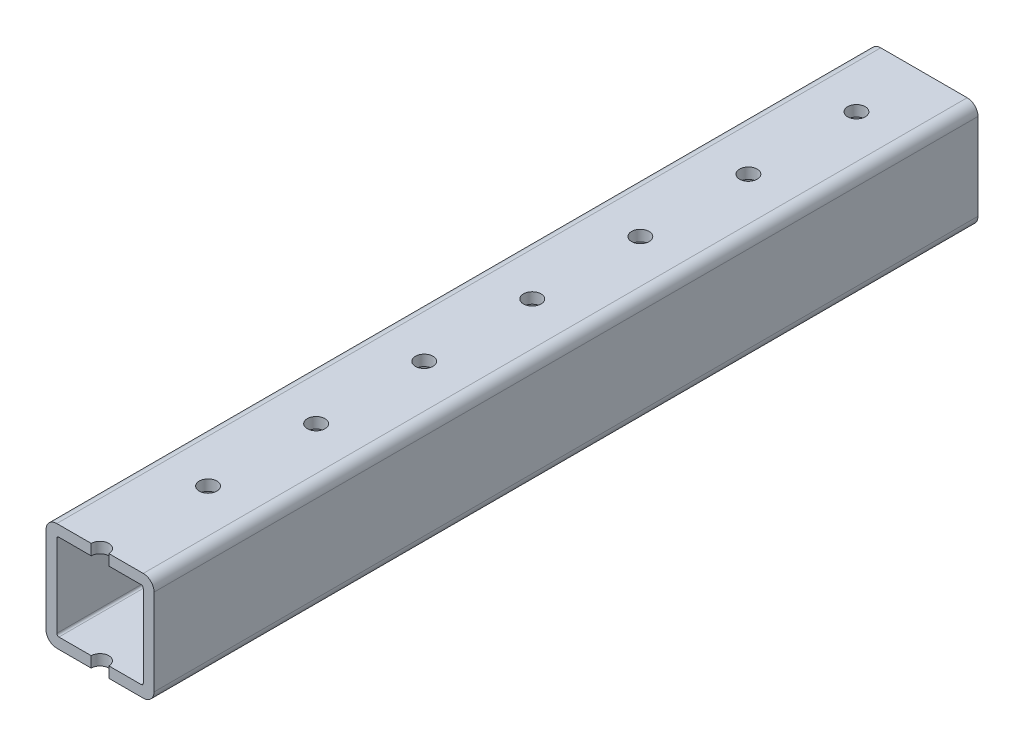
ISO-10303-21;
HEADER;
FILE_DESCRIPTION(('STEP AP214'),'2;1');
FILE_NAME('part.step','',(''),(''),'','','');
FILE_SCHEMA(('AUTOMOTIVE_DESIGN { 1 0 10303 214 1 1 1 1 }'));
ENDSEC;
DATA;
#1=APPLICATION_CONTEXT('core data for automotive mechanical design processes');
#2=APPLICATION_PROTOCOL_DEFINITION('international standard','automotive_design',2000,#1);
#3=PRODUCT_CONTEXT('',#1,'mechanical');
#4=PRODUCT('Part','Part','',(#3));
#5=PRODUCT_RELATED_PRODUCT_CATEGORY('part','',(#4));
#6=PRODUCT_DEFINITION_FORMATION('','',#4);
#7=PRODUCT_DEFINITION_CONTEXT('part definition',#1,'design');
#8=PRODUCT_DEFINITION('design','',#6,#7);
#9=PRODUCT_DEFINITION_SHAPE('','',#8);
#10=(LENGTH_UNIT() NAMED_UNIT(*) SI_UNIT(.MILLI.,.METRE.));
#11=(NAMED_UNIT(*) PLANE_ANGLE_UNIT() SI_UNIT($,.RADIAN.));
#12=(NAMED_UNIT(*) SI_UNIT($,.STERADIAN.) SOLID_ANGLE_UNIT());
#13=UNCERTAINTY_MEASURE_WITH_UNIT(LENGTH_MEASURE(1.E-05),#10,'distance_accuracy_value','');
#14=(GEOMETRIC_REPRESENTATION_CONTEXT(3) GLOBAL_UNCERTAINTY_ASSIGNED_CONTEXT((#13)) GLOBAL_UNIT_ASSIGNED_CONTEXT((#10,
#11,#12)) REPRESENTATION_CONTEXT('',''));
#15=CARTESIAN_POINT('',(0.,0.,0.));
#16=DIRECTION('',(0.,0.,1.));
#17=DIRECTION('',(1.,0.,0.));
#18=AXIS2_PLACEMENT_3D('',#15,#16,#17);
#19=CARTESIAN_POINT('',(0.,0.,-269.874999999994));
#20=DIRECTION('',(0.,0.,-1.));
#21=DIRECTION('',(-1.,0.,0.));
#22=AXIS2_PLACEMENT_3D('',#19,#20,#21);
#23=PLANE('',#22);
#24=DIRECTION('',(1.,0.,0.));
#25=VECTOR('',#24,1.);
#26=CARTESIAN_POINT('',(-10.16,10.16,-269.874999999994));
#27=LINE('',#26,#25);
#28=CARTESIAN_POINT('',(-9.65999999999999,10.16,-269.874999999994));
#29=VERTEX_POINT('',#28);
#30=CARTESIAN_POINT('',(9.66,10.16,-269.874999999994));
#31=VERTEX_POINT('',#30);
#32=EDGE_CURVE('E228',#29,#31,#27,.T.);
#33=ORIENTED_EDGE('',*,*,#32,.F.);
#34=CARTESIAN_POINT('',(-9.65999999999999,9.66,-269.874999999994));
#35=DIRECTION('',(0.,0.,-1.));
#36=DIRECTION('',(-1.,0.,0.));
#37=AXIS2_PLACEMENT_3D('',#34,#35,#36);
#38=CIRCLE('',#37,0.5);
#39=CARTESIAN_POINT('',(-10.16,9.66,-269.874999999994));
#40=VERTEX_POINT('',#39);
#41=EDGE_CURVE('E226',#29,#40,#38,.F.);
#42=ORIENTED_EDGE('',*,*,#41,.T.);
#43=DIRECTION('',(0.,1.,0.));
#44=VECTOR('',#43,1.);
#45=CARTESIAN_POINT('',(-10.16,-10.16,-269.874999999994));
#46=LINE('',#45,#44);
#47=CARTESIAN_POINT('',(-10.16,-9.66,-269.874999999994));
#48=VERTEX_POINT('',#47);
#49=EDGE_CURVE('E220',#48,#40,#46,.T.);
#50=ORIENTED_EDGE('',*,*,#49,.F.);
#51=CARTESIAN_POINT('',(-9.65999999999999,-9.66,-269.874999999994));
#52=DIRECTION('',(0.,0.,-1.));
#53=DIRECTION('',(-1.,0.,0.));
#54=AXIS2_PLACEMENT_3D('',#51,#52,#53);
#55=CIRCLE('',#54,0.5);
#56=CARTESIAN_POINT('',(-9.65999999999999,-10.16,-269.874999999994));
#57=VERTEX_POINT('',#56);
#58=EDGE_CURVE('E215',#48,#57,#55,.F.);
#59=ORIENTED_EDGE('',*,*,#58,.T.);
#60=DIRECTION('',(-1.,0.,0.));
#61=VECTOR('',#60,1.);
#62=CARTESIAN_POINT('',(-10.16,-10.16,-269.874999999994));
#63=LINE('',#62,#61);
#64=CARTESIAN_POINT('',(9.66,-10.16,-269.874999999994));
#65=VERTEX_POINT('',#64);
#66=EDGE_CURVE('E209',#65,#57,#63,.T.);
#67=ORIENTED_EDGE('',*,*,#66,.F.);
#68=CARTESIAN_POINT('',(9.66,-9.66,-269.874999999994));
#69=DIRECTION('',(0.,0.,-1.));
#70=DIRECTION('',(-1.,0.,0.));
#71=AXIS2_PLACEMENT_3D('',#68,#69,#70);
#72=CIRCLE('',#71,0.5);
#73=CARTESIAN_POINT('',(10.16,-9.66,-269.874999999994));
#74=VERTEX_POINT('',#73);
#75=EDGE_CURVE('E213',#65,#74,#72,.F.);
#76=ORIENTED_EDGE('',*,*,#75,.T.);
#77=DIRECTION('',(0.,-1.,0.));
#78=VECTOR('',#77,1.);
#79=CARTESIAN_POINT('',(10.16,-10.16,-269.874999999994));
#80=LINE('',#79,#78);
#81=CARTESIAN_POINT('',(10.16,9.65999999999999,-269.874999999994));
#82=VERTEX_POINT('',#81);
#83=EDGE_CURVE('E217',#82,#74,#80,.T.);
#84=ORIENTED_EDGE('',*,*,#83,.F.);
#85=CARTESIAN_POINT('',(9.66,9.65999999999999,-269.874999999994));
#86=DIRECTION('',(0.,0.,-1.));
#87=DIRECTION('',(-1.,0.,0.));
#88=AXIS2_PLACEMENT_3D('',#85,#86,#87);
#89=CIRCLE('',#88,0.5);
#90=EDGE_CURVE('E224',#82,#31,#89,.F.);
#91=ORIENTED_EDGE('',*,*,#90,.T.);
#92=EDGE_LOOP('',(#33,#42,#50,#59,#67,#76,#84,#91));
#93=FACE_BOUND('',#92,.T.);
#94=CARTESIAN_POINT('',(-10.16,10.16,-269.874999999994));
#95=DIRECTION('',(0.,0.,-1.));
#96=DIRECTION('',(-1.,0.,0.));
#97=AXIS2_PLACEMENT_3D('',#94,#95,#96);
#98=CIRCLE('',#97,2.54);
#99=CARTESIAN_POINT('',(-10.16,12.7,-269.874999999994));
#100=VERTEX_POINT('',#99);
#101=CARTESIAN_POINT('',(-12.7,10.16,-269.874999999994));
#102=VERTEX_POINT('',#101);
#103=EDGE_CURVE('E59',#100,#102,#98,.F.);
#104=ORIENTED_EDGE('',*,*,#103,.F.);
#105=DIRECTION('',(1.,0.,0.));
#106=VECTOR('',#105,1.);
#107=CARTESIAN_POINT('',(-10.16,12.7,-269.874999999994));
#108=LINE('',#107,#106);
#109=CARTESIAN_POINT('',(10.16,12.7,-269.874999999994));
#110=VERTEX_POINT('',#109);
#111=EDGE_CURVE('E52',#100,#110,#108,.T.);
#112=ORIENTED_EDGE('',*,*,#111,.T.);
#113=CARTESIAN_POINT('',(10.16,10.16,-269.874999999994));
#114=DIRECTION('',(0.,0.,-1.));
#115=DIRECTION('',(-1.,0.,0.));
#116=AXIS2_PLACEMENT_3D('',#113,#114,#115);
#117=CIRCLE('',#116,2.54);
#118=CARTESIAN_POINT('',(12.7,10.16,-269.874999999994));
#119=VERTEX_POINT('',#118);
#120=EDGE_CURVE('E195',#119,#110,#117,.F.);
#121=ORIENTED_EDGE('',*,*,#120,.F.);
#122=DIRECTION('',(0.,-1.,0.));
#123=VECTOR('',#122,1.);
#124=CARTESIAN_POINT('',(12.7,-10.16,-269.874999999994));
#125=LINE('',#124,#123);
#126=CARTESIAN_POINT('',(12.7,-10.16,-269.874999999994));
#127=VERTEX_POINT('',#126);
#128=EDGE_CURVE('E12',#119,#127,#125,.T.);
#129=ORIENTED_EDGE('',*,*,#128,.T.);
#130=CARTESIAN_POINT('',(10.16,-10.16,-269.874999999994));
#131=DIRECTION('',(0.,0.,-1.));
#132=DIRECTION('',(-1.,0.,0.));
#133=AXIS2_PLACEMENT_3D('',#130,#131,#132);
#134=CIRCLE('',#133,2.54);
#135=CARTESIAN_POINT('',(10.16,-12.7,-269.874999999994));
#136=VERTEX_POINT('',#135);
#137=EDGE_CURVE('E188',#136,#127,#134,.F.);
#138=ORIENTED_EDGE('',*,*,#137,.F.);
#139=DIRECTION('',(-1.,0.,0.));
#140=VECTOR('',#139,1.);
#141=CARTESIAN_POINT('',(-10.16,-12.7,-269.874999999994));
#142=LINE('',#141,#140);
#143=CARTESIAN_POINT('',(-10.16,-12.7,-269.874999999994));
#144=VERTEX_POINT('',#143);
#145=EDGE_CURVE('E194',#136,#144,#142,.T.);
#146=ORIENTED_EDGE('',*,*,#145,.T.);
#147=CARTESIAN_POINT('',(-10.16,-10.16,-269.874999999994));
#148=DIRECTION('',(0.,0.,-1.));
#149=DIRECTION('',(-1.,0.,0.));
#150=AXIS2_PLACEMENT_3D('',#147,#148,#149);
#151=CIRCLE('',#150,2.54);
#152=CARTESIAN_POINT('',(-12.7,-10.16,-269.874999999994));
#153=VERTEX_POINT('',#152);
#154=EDGE_CURVE('E202',#153,#144,#151,.F.);
#155=ORIENTED_EDGE('',*,*,#154,.F.);
#156=DIRECTION('',(0.,1.,0.));
#157=VECTOR('',#156,1.);
#158=CARTESIAN_POINT('',(-12.7,-10.16,-269.874999999994));
#159=LINE('',#158,#157);
#160=EDGE_CURVE('E204',#153,#102,#159,.T.);
#161=ORIENTED_EDGE('',*,*,#160,.T.);
#162=EDGE_LOOP('',(#104,#112,#121,#129,#138,#146,#155,#161));
#163=FACE_BOUND('',#162,.T.);
#164=ADVANCED_FACE('F37',(#93,#163),#23,.T.);
#165=CARTESIAN_POINT('',(-9.65999999999999,9.66,749.3));
#166=DIRECTION('',(0.,0.,1.));
#167=DIRECTION('',(1.,0.,0.));
#168=AXIS2_PLACEMENT_3D('',#165,#166,#167);
#169=CYLINDRICAL_SURFACE('',#168,0.5);
#170=ORIENTED_EDGE('',*,*,#41,.F.);
#171=DIRECTION('',(0.,0.,-1.));
#172=VECTOR('',#171,1.);
#173=CARTESIAN_POINT('',(-9.65999999999999,10.16,749.3));
#174=LINE('',#173,#172);
#175=CARTESIAN_POINT('',(-9.65999999999999,10.16,-76.2));
#176=VERTEX_POINT('',#175);
#177=EDGE_CURVE('E369',#176,#29,#174,.T.);
#178=ORIENTED_EDGE('',*,*,#177,.F.);
#179=CARTESIAN_POINT('',(-9.65999999999999,9.66,-76.2));
#180=DIRECTION('',(0.,0.,1.));
#181=DIRECTION('',(1.,0.,0.));
#182=AXIS2_PLACEMENT_3D('',#179,#180,#181);
#183=CIRCLE('',#182,0.5);
#184=CARTESIAN_POINT('',(-10.16,9.66,-76.2));
#185=VERTEX_POINT('',#184);
#186=EDGE_CURVE('E282',#185,#176,#183,.F.);
#187=ORIENTED_EDGE('',*,*,#186,.F.);
#188=DIRECTION('',(0.,0.,-1.));
#189=VECTOR('',#188,1.);
#190=CARTESIAN_POINT('',(-10.16,9.66,749.3));
#191=LINE('',#190,#189);
#192=EDGE_CURVE('E299',#40,#185,#191,.F.);
#193=ORIENTED_EDGE('',*,*,#192,.F.);
#194=EDGE_LOOP('',(#170,#178,#187,#193));
#195=FACE_BOUND('',#194,.T.);
#196=ADVANCED_FACE('F39',(#195),#169,.F.);
#197=CARTESIAN_POINT('',(9.66,9.65999999999999,749.3));
#198=DIRECTION('',(0.,0.,1.));
#199=DIRECTION('',(1.,0.,0.));
#200=AXIS2_PLACEMENT_3D('',#197,#198,#199);
#201=CYLINDRICAL_SURFACE('',#200,0.5);
#202=ORIENTED_EDGE('',*,*,#90,.F.);
#203=DIRECTION('',(0.,0.,1.));
#204=VECTOR('',#203,1.);
#205=CARTESIAN_POINT('',(10.16,9.65999999999999,749.3));
#206=LINE('',#205,#204);
#207=CARTESIAN_POINT('',(10.16,9.65999999999999,-76.2));
#208=VERTEX_POINT('',#207);
#209=EDGE_CURVE('E286',#208,#82,#206,.F.);
#210=ORIENTED_EDGE('',*,*,#209,.F.);
#211=CARTESIAN_POINT('',(9.66,9.65999999999999,-76.2));
#212=DIRECTION('',(0.,0.,1.));
#213=DIRECTION('',(1.,0.,0.));
#214=AXIS2_PLACEMENT_3D('',#211,#212,#213);
#215=CIRCLE('',#214,0.5);
#216=CARTESIAN_POINT('',(9.66,10.16,-76.2));
#217=VERTEX_POINT('',#216);
#218=EDGE_CURVE('E259',#217,#208,#215,.F.);
#219=ORIENTED_EDGE('',*,*,#218,.F.);
#220=DIRECTION('',(0.,0.,-1.));
#221=VECTOR('',#220,1.);
#222=CARTESIAN_POINT('',(9.66,10.16,749.3));
#223=LINE('',#222,#221);
#224=EDGE_CURVE('E298',#31,#217,#223,.F.);
#225=ORIENTED_EDGE('',*,*,#224,.F.);
#226=EDGE_LOOP('',(#202,#210,#219,#225));
#227=FACE_BOUND('',#226,.T.);
#228=ADVANCED_FACE('F477',(#227),#201,.F.);
#229=CARTESIAN_POINT('',(-9.65999999999999,-9.66,749.3));
#230=DIRECTION('',(0.,0.,1.));
#231=DIRECTION('',(1.,0.,0.));
#232=AXIS2_PLACEMENT_3D('',#229,#230,#231);
#233=CYLINDRICAL_SURFACE('',#232,0.5);
#234=ORIENTED_EDGE('',*,*,#58,.F.);
#235=DIRECTION('',(0.,0.,-1.));
#236=VECTOR('',#235,1.);
#237=CARTESIAN_POINT('',(-10.16,-9.66,749.3));
#238=LINE('',#237,#236);
#239=CARTESIAN_POINT('',(-10.16,-9.66,-76.2));
#240=VERTEX_POINT('',#239);
#241=EDGE_CURVE('E294',#240,#48,#238,.T.);
#242=ORIENTED_EDGE('',*,*,#241,.F.);
#243=CARTESIAN_POINT('',(-9.65999999999999,-9.66,-76.2));
#244=DIRECTION('',(0.,0.,1.));
#245=DIRECTION('',(1.,0.,0.));
#246=AXIS2_PLACEMENT_3D('',#243,#244,#245);
#247=CIRCLE('',#246,0.5);
#248=CARTESIAN_POINT('',(-9.65999999999999,-10.16,-76.2));
#249=VERTEX_POINT('',#248);
#250=EDGE_CURVE('E266',#249,#240,#247,.F.);
#251=ORIENTED_EDGE('',*,*,#250,.F.);
#252=DIRECTION('',(0.,0.,1.));
#253=VECTOR('',#252,1.);
#254=CARTESIAN_POINT('',(-9.65999999999999,-10.16,749.3));
#255=LINE('',#254,#253);
#256=EDGE_CURVE('E293',#57,#249,#255,.T.);
#257=ORIENTED_EDGE('',*,*,#256,.F.);
#258=EDGE_LOOP('',(#234,#242,#251,#257));
#259=FACE_BOUND('',#258,.T.);
#260=ADVANCED_FACE('F531',(#259),#233,.F.);
#261=CARTESIAN_POINT('',(9.66,-9.66,749.3));
#262=DIRECTION('',(0.,0.,1.));
#263=DIRECTION('',(1.,0.,0.));
#264=AXIS2_PLACEMENT_3D('',#261,#262,#263);
#265=CYLINDRICAL_SURFACE('',#264,0.5);
#266=ORIENTED_EDGE('',*,*,#75,.F.);
#267=DIRECTION('',(0.,0.,1.));
#268=VECTOR('',#267,1.);
#269=CARTESIAN_POINT('',(9.66,-10.16,749.3));
#270=LINE('',#269,#268);
#271=CARTESIAN_POINT('',(9.66,-10.16,-76.2));
#272=VERTEX_POINT('',#271);
#273=EDGE_CURVE('E340',#272,#65,#270,.F.);
#274=ORIENTED_EDGE('',*,*,#273,.F.);
#275=CARTESIAN_POINT('',(9.66,-9.66,-76.2));
#276=DIRECTION('',(0.,0.,1.));
#277=DIRECTION('',(1.,0.,0.));
#278=AXIS2_PLACEMENT_3D('',#275,#276,#277);
#279=CIRCLE('',#278,0.5);
#280=CARTESIAN_POINT('',(10.16,-9.66,-76.2));
#281=VERTEX_POINT('',#280);
#282=EDGE_CURVE('E255',#281,#272,#279,.F.);
#283=ORIENTED_EDGE('',*,*,#282,.F.);
#284=DIRECTION('',(0.,0.,1.));
#285=VECTOR('',#284,1.);
#286=CARTESIAN_POINT('',(10.16,-9.66,749.3));
#287=LINE('',#286,#285);
#288=EDGE_CURVE('E289',#74,#281,#287,.T.);
#289=ORIENTED_EDGE('',*,*,#288,.F.);
#290=EDGE_LOOP('',(#266,#274,#283,#289));
#291=FACE_BOUND('',#290,.T.);
#292=ADVANCED_FACE('F535',(#291),#265,.F.);
#293=CARTESIAN_POINT('',(-10.16,12.7,749.3));
#294=DIRECTION('',(0.,-1.,0.));
#295=DIRECTION('',(0.,0.,-1.));
#296=AXIS2_PLACEMENT_3D('',#293,#294,#295);
#297=PLANE('',#296);
#298=CARTESIAN_POINT('',(0.,12.7,-101.6));
#299=DIRECTION('',(0.,1.,0.));
#300=DIRECTION('',(0.,0.,1.));
#301=AXIS2_PLACEMENT_3D('',#298,#299,#300);
#302=CIRCLE('',#301,2.07009999999998);
#303=CARTESIAN_POINT('',(0.,12.7,-99.5298999999999));
#304=VERTEX_POINT('',#303);
#305=EDGE_CURVE('E406',#304,#304,#302,.T.);
#306=ORIENTED_EDGE('',*,*,#305,.F.);
#307=EDGE_LOOP('',(#306));
#308=FACE_BOUND('',#307,.T.);
#309=CARTESIAN_POINT('',(0.,12.7,-127.));
#310=DIRECTION('',(0.,1.,0.));
#311=DIRECTION('',(0.,0.,1.));
#312=AXIS2_PLACEMENT_3D('',#309,#310,#311);
#313=CIRCLE('',#312,2.07009999999998);
#314=CARTESIAN_POINT('',(0.,12.7,-124.9299));
#315=VERTEX_POINT('',#314);
#316=EDGE_CURVE('E409',#315,#315,#313,.T.);
#317=ORIENTED_EDGE('',*,*,#316,.F.);
#318=EDGE_LOOP('',(#317));
#319=FACE_BOUND('',#318,.T.);
#320=CARTESIAN_POINT('',(0.,12.7,-152.4));
#321=DIRECTION('',(0.,1.,0.));
#322=DIRECTION('',(0.,0.,1.));
#323=AXIS2_PLACEMENT_3D('',#320,#321,#322);
#324=CIRCLE('',#323,2.07009999999996);
#325=CARTESIAN_POINT('',(0.,12.7,-150.3299));
#326=VERTEX_POINT('',#325);
#327=EDGE_CURVE('E412',#326,#326,#324,.T.);
#328=ORIENTED_EDGE('',*,*,#327,.F.);
#329=EDGE_LOOP('',(#328));
#330=FACE_BOUND('',#329,.T.);
#331=CARTESIAN_POINT('',(0.,12.7,-177.8));
#332=DIRECTION('',(0.,1.,0.));
#333=DIRECTION('',(0.,0.,1.));
#334=AXIS2_PLACEMENT_3D('',#331,#332,#333);
#335=CIRCLE('',#334,2.07009999999996);
#336=CARTESIAN_POINT('',(0.,12.7,-175.7299));
#337=VERTEX_POINT('',#336);
#338=EDGE_CURVE('E415',#337,#337,#335,.T.);
#339=ORIENTED_EDGE('',*,*,#338,.F.);
#340=EDGE_LOOP('',(#339));
#341=FACE_BOUND('',#340,.T.);
#342=CARTESIAN_POINT('',(0.,12.7,-203.2));
#343=DIRECTION('',(0.,1.,0.));
#344=DIRECTION('',(0.,0.,1.));
#345=AXIS2_PLACEMENT_3D('',#342,#343,#344);
#346=CIRCLE('',#345,2.07009999999996);
#347=CARTESIAN_POINT('',(0.,12.7,-201.1299));
#348=VERTEX_POINT('',#347);
#349=EDGE_CURVE('E418',#348,#348,#346,.T.);
#350=ORIENTED_EDGE('',*,*,#349,.F.);
#351=EDGE_LOOP('',(#350));
#352=FACE_BOUND('',#351,.T.);
#353=CARTESIAN_POINT('',(0.,12.7,-228.6));
#354=DIRECTION('',(0.,1.,0.));
#355=DIRECTION('',(0.,0.,1.));
#356=AXIS2_PLACEMENT_3D('',#353,#354,#355);
#357=CIRCLE('',#356,2.07009999999996);
#358=CARTESIAN_POINT('',(0.,12.7,-226.5299));
#359=VERTEX_POINT('',#358);
#360=EDGE_CURVE('E422',#359,#359,#357,.T.);
#361=ORIENTED_EDGE('',*,*,#360,.F.);
#362=EDGE_LOOP('',(#361));
#363=FACE_BOUND('',#362,.T.);
#364=CARTESIAN_POINT('',(0.,12.7,-254.));
#365=DIRECTION('',(0.,1.,0.));
#366=DIRECTION('',(0.,0.,1.));
#367=AXIS2_PLACEMENT_3D('',#364,#365,#366);
#368=CIRCLE('',#367,2.07009999999996);
#369=CARTESIAN_POINT('',(0.,12.7,-251.9299));
#370=VERTEX_POINT('',#369);
#371=EDGE_CURVE('E425',#370,#370,#368,.T.);
#372=ORIENTED_EDGE('',*,*,#371,.F.);
#373=EDGE_LOOP('',(#372));
#374=FACE_BOUND('',#373,.T.);
#375=ORIENTED_EDGE('',*,*,#111,.F.);
#376=DIRECTION('',(0.,0.,-1.));
#377=VECTOR('',#376,1.);
#378=CARTESIAN_POINT('',(-10.16,12.7,749.3));
#379=LINE('',#378,#377);
#380=CARTESIAN_POINT('',(-10.16,12.7,-76.2));
#381=VERTEX_POINT('',#380);
#382=EDGE_CURVE('E310',#381,#100,#379,.T.);
#383=ORIENTED_EDGE('',*,*,#382,.F.);
#384=DIRECTION('',(-1.,0.,0.));
#385=VECTOR('',#384,1.);
#386=CARTESIAN_POINT('',(-10.16,12.7,-76.2));
#387=LINE('',#386,#385);
#388=CARTESIAN_POINT('',(-2.07009999999998,12.7,-76.2));
#389=VERTEX_POINT('',#388);
#390=EDGE_CURVE('E244',#389,#381,#387,.T.);
#391=ORIENTED_EDGE('',*,*,#390,.F.);
#392=CARTESIAN_POINT('',(0.,12.7,-76.1999999999999));
#393=DIRECTION('',(0.,1.,0.));
#394=DIRECTION('',(0.,0.,1.));
#395=AXIS2_PLACEMENT_3D('',#392,#393,#394);
#396=CIRCLE('',#395,2.07009999999998);
#397=CARTESIAN_POINT('',(2.07009999999998,12.7,-76.2));
#398=VERTEX_POINT('',#397);
#399=EDGE_CURVE('E402',#398,#389,#396,.T.);
#400=ORIENTED_EDGE('',*,*,#399,.F.);
#401=CARTESIAN_POINT('',(10.16,12.7,-76.2));
#402=VERTEX_POINT('',#401);
#403=EDGE_CURVE('E239',#402,#398,#387,.T.);
#404=ORIENTED_EDGE('',*,*,#403,.F.);
#405=DIRECTION('',(0.,0.,-1.));
#406=VECTOR('',#405,1.);
#407=CARTESIAN_POINT('',(10.16,12.7,749.3));
#408=LINE('',#407,#406);
#409=EDGE_CURVE('E184',#110,#402,#408,.F.);
#410=ORIENTED_EDGE('',*,*,#409,.F.);
#411=EDGE_LOOP('',(#375,#383,#391,#400,#404,#410));
#412=FACE_BOUND('',#411,.T.);
#413=ADVANCED_FACE('F452',(#308,#319,#330,#341,#352,#363,#374,#412),#297,.F.);
#414=CARTESIAN_POINT('',(-10.16,10.16,749.3));
#415=DIRECTION('',(0.,0.,-1.));
#416=DIRECTION('',(-1.,0.,0.));
#417=AXIS2_PLACEMENT_3D('',#414,#415,#416);
#418=CYLINDRICAL_SURFACE('',#417,2.54);
#419=ORIENTED_EDGE('',*,*,#382,.T.);
#420=ORIENTED_EDGE('',*,*,#103,.T.);
#421=DIRECTION('',(0.,0.,-1.));
#422=VECTOR('',#421,1.);
#423=CARTESIAN_POINT('',(-12.7,10.16,749.3));
#424=LINE('',#423,#422);
#425=CARTESIAN_POINT('',(-12.7,10.16,-76.2));
#426=VERTEX_POINT('',#425);
#427=EDGE_CURVE('E307',#102,#426,#424,.F.);
#428=ORIENTED_EDGE('',*,*,#427,.T.);
#429=CARTESIAN_POINT('',(-10.16,10.16,-76.2));
#430=DIRECTION('',(0.,0.,1.));
#431=DIRECTION('',(1.,0.,0.));
#432=AXIS2_PLACEMENT_3D('',#429,#430,#431);
#433=CIRCLE('',#432,2.54);
#434=EDGE_CURVE('E277',#426,#381,#433,.F.);
#435=ORIENTED_EDGE('',*,*,#434,.T.);
#436=EDGE_LOOP('',(#419,#420,#428,#435));
#437=FACE_BOUND('',#436,.T.);
#438=ADVANCED_FACE('F446',(#437),#418,.T.);
#439=CARTESIAN_POINT('',(-12.7,-10.16,749.3));
#440=DIRECTION('',(1.,0.,0.));
#441=DIRECTION('',(0.,0.,-1.));
#442=AXIS2_PLACEMENT_3D('',#439,#440,#441);
#443=PLANE('',#442);
#444=ORIENTED_EDGE('',*,*,#160,.F.);
#445=DIRECTION('',(0.,0.,-1.));
#446=VECTOR('',#445,1.);
#447=CARTESIAN_POINT('',(-12.7,-10.16,749.3));
#448=LINE('',#447,#446);
#449=CARTESIAN_POINT('',(-12.7,-10.16,-76.2));
#450=VERTEX_POINT('',#449);
#451=EDGE_CURVE('E302',#450,#153,#448,.T.);
#452=ORIENTED_EDGE('',*,*,#451,.F.);
#453=DIRECTION('',(0.,-1.,0.));
#454=VECTOR('',#453,1.);
#455=CARTESIAN_POINT('',(-12.7,-10.16,-76.2));
#456=LINE('',#455,#454);
#457=EDGE_CURVE('E274',#426,#450,#456,.T.);
#458=ORIENTED_EDGE('',*,*,#457,.F.);
#459=ORIENTED_EDGE('',*,*,#427,.F.);
#460=EDGE_LOOP('',(#444,#452,#458,#459));
#461=FACE_BOUND('',#460,.T.);
#462=ADVANCED_FACE('F444',(#461),#443,.F.);
#463=CARTESIAN_POINT('',(-10.16,-10.16,749.3));
#464=DIRECTION('',(0.,0.,-1.));
#465=DIRECTION('',(-1.,0.,0.));
#466=AXIS2_PLACEMENT_3D('',#463,#464,#465);
#467=CYLINDRICAL_SURFACE('',#466,2.54);
#468=ORIENTED_EDGE('',*,*,#451,.T.);
#469=ORIENTED_EDGE('',*,*,#154,.T.);
#470=DIRECTION('',(0.,0.,-1.));
#471=VECTOR('',#470,1.);
#472=CARTESIAN_POINT('',(-10.16,-12.7,749.3));
#473=LINE('',#472,#471);
#474=CARTESIAN_POINT('',(-10.16,-12.7,-76.2));
#475=VERTEX_POINT('',#474);
#476=EDGE_CURVE('E306',#144,#475,#473,.F.);
#477=ORIENTED_EDGE('',*,*,#476,.T.);
#478=CARTESIAN_POINT('',(-10.16,-10.16,-76.2));
#479=DIRECTION('',(0.,0.,1.));
#480=DIRECTION('',(1.,0.,0.));
#481=AXIS2_PLACEMENT_3D('',#478,#479,#480);
#482=CIRCLE('',#481,2.54);
#483=EDGE_CURVE('E271',#475,#450,#482,.F.);
#484=ORIENTED_EDGE('',*,*,#483,.T.);
#485=EDGE_LOOP('',(#468,#469,#477,#484));
#486=FACE_BOUND('',#485,.T.);
#487=ADVANCED_FACE('F439',(#486),#467,.T.);
#488=CARTESIAN_POINT('',(-10.16,-12.7,749.3));
#489=DIRECTION('',(0.,1.,0.));
#490=DIRECTION('',(0.,0.,1.));
#491=AXIS2_PLACEMENT_3D('',#488,#489,#490);
#492=PLANE('',#491);
#493=CARTESIAN_POINT('',(0.,-12.7,-101.6));
#494=DIRECTION('',(0.,1.,0.));
#495=DIRECTION('',(0.,0.,1.));
#496=AXIS2_PLACEMENT_3D('',#493,#494,#495);
#497=CIRCLE('',#496,2.07009999999998);
#498=CARTESIAN_POINT('',(0.,-12.7,-99.5298999999999));
#499=VERTEX_POINT('',#498);
#500=EDGE_CURVE('E375',#499,#499,#497,.F.);
#501=ORIENTED_EDGE('',*,*,#500,.F.);
#502=EDGE_LOOP('',(#501));
#503=FACE_BOUND('',#502,.T.);
#504=CARTESIAN_POINT('',(0.,-12.7,-127.));
#505=DIRECTION('',(0.,1.,0.));
#506=DIRECTION('',(0.,0.,1.));
#507=AXIS2_PLACEMENT_3D('',#504,#505,#506);
#508=CIRCLE('',#507,2.07009999999998);
#509=CARTESIAN_POINT('',(0.,-12.7,-124.9299));
#510=VERTEX_POINT('',#509);
#511=EDGE_CURVE('E378',#510,#510,#508,.F.);
#512=ORIENTED_EDGE('',*,*,#511,.F.);
#513=EDGE_LOOP('',(#512));
#514=FACE_BOUND('',#513,.T.);
#515=CARTESIAN_POINT('',(0.,-12.7,-152.4));
#516=DIRECTION('',(0.,1.,0.));
#517=DIRECTION('',(0.,0.,1.));
#518=AXIS2_PLACEMENT_3D('',#515,#516,#517);
#519=CIRCLE('',#518,2.07009999999996);
#520=CARTESIAN_POINT('',(0.,-12.7,-150.3299));
#521=VERTEX_POINT('',#520);
#522=EDGE_CURVE('E381',#521,#521,#519,.F.);
#523=ORIENTED_EDGE('',*,*,#522,.F.);
#524=EDGE_LOOP('',(#523));
#525=FACE_BOUND('',#524,.T.);
#526=CARTESIAN_POINT('',(0.,-12.7,-177.8));
#527=DIRECTION('',(0.,1.,0.));
#528=DIRECTION('',(0.,0.,1.));
#529=AXIS2_PLACEMENT_3D('',#526,#527,#528);
#530=CIRCLE('',#529,2.07009999999996);
#531=CARTESIAN_POINT('',(0.,-12.7,-175.7299));
#532=VERTEX_POINT('',#531);
#533=EDGE_CURVE('E385',#532,#532,#530,.F.);
#534=ORIENTED_EDGE('',*,*,#533,.F.);
#535=EDGE_LOOP('',(#534));
#536=FACE_BOUND('',#535,.T.);
#537=CARTESIAN_POINT('',(0.,-12.7,-203.2));
#538=DIRECTION('',(0.,1.,0.));
#539=DIRECTION('',(0.,0.,1.));
#540=AXIS2_PLACEMENT_3D('',#537,#538,#539);
#541=CIRCLE('',#540,2.07009999999996);
#542=CARTESIAN_POINT('',(0.,-12.7,-201.1299));
#543=VERTEX_POINT('',#542);
#544=EDGE_CURVE('E388',#543,#543,#541,.F.);
#545=ORIENTED_EDGE('',*,*,#544,.F.);
#546=EDGE_LOOP('',(#545));
#547=FACE_BOUND('',#546,.T.);
#548=CARTESIAN_POINT('',(0.,-12.7,-228.6));
#549=DIRECTION('',(0.,1.,0.));
#550=DIRECTION('',(0.,0.,1.));
#551=AXIS2_PLACEMENT_3D('',#548,#549,#550);
#552=CIRCLE('',#551,2.07009999999996);
#553=CARTESIAN_POINT('',(0.,-12.7,-226.5299));
#554=VERTEX_POINT('',#553);
#555=EDGE_CURVE('E391',#554,#554,#552,.F.);
#556=ORIENTED_EDGE('',*,*,#555,.F.);
#557=EDGE_LOOP('',(#556));
#558=FACE_BOUND('',#557,.T.);
#559=CARTESIAN_POINT('',(0.,-12.7,-254.));
#560=DIRECTION('',(0.,1.,0.));
#561=DIRECTION('',(0.,0.,1.));
#562=AXIS2_PLACEMENT_3D('',#559,#560,#561);
#563=CIRCLE('',#562,2.07009999999996);
#564=CARTESIAN_POINT('',(0.,-12.7,-251.9299));
#565=VERTEX_POINT('',#564);
#566=EDGE_CURVE('E395',#565,#565,#563,.F.);
#567=ORIENTED_EDGE('',*,*,#566,.F.);
#568=EDGE_LOOP('',(#567));
#569=FACE_BOUND('',#568,.T.);
#570=ORIENTED_EDGE('',*,*,#145,.F.);
#571=DIRECTION('',(0.,0.,-1.));
#572=VECTOR('',#571,1.);
#573=CARTESIAN_POINT('',(10.16,-12.7,749.3));
#574=LINE('',#573,#572);
#575=CARTESIAN_POINT('',(10.16,-12.7,-76.2));
#576=VERTEX_POINT('',#575);
#577=EDGE_CURVE('E191',#576,#136,#574,.T.);
#578=ORIENTED_EDGE('',*,*,#577,.F.);
#579=DIRECTION('',(1.,0.,0.));
#580=VECTOR('',#579,1.);
#581=CARTESIAN_POINT('',(-10.16,-12.7,-76.2));
#582=LINE('',#581,#580);
#583=CARTESIAN_POINT('',(2.07009999999998,-12.7,-76.2));
#584=VERTEX_POINT('',#583);
#585=EDGE_CURVE('E236',#584,#576,#582,.T.);
#586=ORIENTED_EDGE('',*,*,#585,.F.);
#587=CARTESIAN_POINT('',(0.,-12.7,-76.1999999999999));
#588=DIRECTION('',(0.,1.,0.));
#589=DIRECTION('',(0.,0.,1.));
#590=AXIS2_PLACEMENT_3D('',#587,#588,#589);
#591=CIRCLE('',#590,2.07009999999998);
#592=CARTESIAN_POINT('',(-2.07009999999998,-12.7,-76.2));
#593=VERTEX_POINT('',#592);
#594=EDGE_CURVE('E301',#593,#584,#591,.F.);
#595=ORIENTED_EDGE('',*,*,#594,.F.);
#596=EDGE_CURVE('E240',#475,#593,#582,.T.);
#597=ORIENTED_EDGE('',*,*,#596,.F.);
#598=ORIENTED_EDGE('',*,*,#476,.F.);
#599=EDGE_LOOP('',(#570,#578,#586,#595,#597,#598));
#600=FACE_BOUND('',#599,.T.);
#601=ADVANCED_FACE('F433',(#503,#514,#525,#536,#547,#558,#569,#600),#492,.F.);
#602=CARTESIAN_POINT('',(-10.16,-10.16,749.3));
#603=DIRECTION('',(1.,0.,0.));
#604=DIRECTION('',(0.,0.,-1.));
#605=AXIS2_PLACEMENT_3D('',#602,#603,#604);
#606=PLANE('',#605);
#607=ORIENTED_EDGE('',*,*,#241,.T.);
#608=ORIENTED_EDGE('',*,*,#49,.T.);
#609=ORIENTED_EDGE('',*,*,#192,.T.);
#610=DIRECTION('',(0.,-1.,0.));
#611=VECTOR('',#610,1.);
#612=CARTESIAN_POINT('',(-10.16,-10.16,-76.2));
#613=LINE('',#612,#611);
#614=EDGE_CURVE('E268',#185,#240,#613,.T.);
#615=ORIENTED_EDGE('',*,*,#614,.T.);
#616=EDGE_LOOP('',(#607,#608,#609,#615));
#617=FACE_BOUND('',#616,.T.);
#618=ADVANCED_FACE('F572',(#617),#606,.T.);
#619=CARTESIAN_POINT('',(-10.16,10.16,749.3));
#620=DIRECTION('',(0.,-1.,0.));
#621=DIRECTION('',(0.,0.,-1.));
#622=AXIS2_PLACEMENT_3D('',#619,#620,#621);
#623=PLANE('',#622);
#624=CARTESIAN_POINT('',(0.,10.16,-101.6));
#625=DIRECTION('',(0.,1.,0.));
#626=DIRECTION('',(0.,0.,1.));
#627=AXIS2_PLACEMENT_3D('',#624,#625,#626);
#628=CIRCLE('',#627,2.07009999999998);
#629=CARTESIAN_POINT('',(0.,10.16,-99.5298999999999));
#630=VERTEX_POINT('',#629);
#631=EDGE_CURVE('E348',#630,#630,#628,.T.);
#632=ORIENTED_EDGE('',*,*,#631,.T.);
#633=EDGE_LOOP('',(#632));
#634=FACE_BOUND('',#633,.T.);
#635=CARTESIAN_POINT('',(0.,10.16,-127.));
#636=DIRECTION('',(0.,1.,0.));
#637=DIRECTION('',(0.,0.,1.));
#638=AXIS2_PLACEMENT_3D('',#635,#636,#637);
#639=CIRCLE('',#638,2.07009999999998);
#640=CARTESIAN_POINT('',(0.,10.16,-124.9299));
#641=VERTEX_POINT('',#640);
#642=EDGE_CURVE('E351',#641,#641,#639,.T.);
#643=ORIENTED_EDGE('',*,*,#642,.T.);
#644=EDGE_LOOP('',(#643));
#645=FACE_BOUND('',#644,.T.);
#646=CARTESIAN_POINT('',(0.,10.16,-152.4));
#647=DIRECTION('',(0.,1.,0.));
#648=DIRECTION('',(0.,0.,1.));
#649=AXIS2_PLACEMENT_3D('',#646,#647,#648);
#650=CIRCLE('',#649,2.07009999999996);
#651=CARTESIAN_POINT('',(0.,10.16,-150.3299));
#652=VERTEX_POINT('',#651);
#653=EDGE_CURVE('E354',#652,#652,#650,.T.);
#654=ORIENTED_EDGE('',*,*,#653,.T.);
#655=EDGE_LOOP('',(#654));
#656=FACE_BOUND('',#655,.T.);
#657=CARTESIAN_POINT('',(0.,10.16,-177.8));
#658=DIRECTION('',(0.,1.,0.));
#659=DIRECTION('',(0.,0.,1.));
#660=AXIS2_PLACEMENT_3D('',#657,#658,#659);
#661=CIRCLE('',#660,2.07009999999996);
#662=CARTESIAN_POINT('',(0.,10.16,-175.7299));
#663=VERTEX_POINT('',#662);
#664=EDGE_CURVE('E357',#663,#663,#661,.T.);
#665=ORIENTED_EDGE('',*,*,#664,.T.);
#666=EDGE_LOOP('',(#665));
#667=FACE_BOUND('',#666,.T.);
#668=CARTESIAN_POINT('',(0.,10.16,-203.2));
#669=DIRECTION('',(0.,1.,0.));
#670=DIRECTION('',(0.,0.,1.));
#671=AXIS2_PLACEMENT_3D('',#668,#669,#670);
#672=CIRCLE('',#671,2.07009999999996);
#673=CARTESIAN_POINT('',(0.,10.16,-201.1299));
#674=VERTEX_POINT('',#673);
#675=EDGE_CURVE('E360',#674,#674,#672,.T.);
#676=ORIENTED_EDGE('',*,*,#675,.T.);
#677=EDGE_LOOP('',(#676));
#678=FACE_BOUND('',#677,.T.);
#679=CARTESIAN_POINT('',(0.,10.16,-228.6));
#680=DIRECTION('',(0.,1.,0.));
#681=DIRECTION('',(0.,0.,1.));
#682=AXIS2_PLACEMENT_3D('',#679,#680,#681);
#683=CIRCLE('',#682,2.07009999999996);
#684=CARTESIAN_POINT('',(0.,10.16,-226.5299));
#685=VERTEX_POINT('',#684);
#686=EDGE_CURVE('E363',#685,#685,#683,.T.);
#687=ORIENTED_EDGE('',*,*,#686,.T.);
#688=EDGE_LOOP('',(#687));
#689=FACE_BOUND('',#688,.T.);
#690=CARTESIAN_POINT('',(0.,10.16,-254.));
#691=DIRECTION('',(0.,1.,0.));
#692=DIRECTION('',(0.,0.,1.));
#693=AXIS2_PLACEMENT_3D('',#690,#691,#692);
#694=CIRCLE('',#693,2.07009999999996);
#695=CARTESIAN_POINT('',(0.,10.16,-251.9299));
#696=VERTEX_POINT('',#695);
#697=EDGE_CURVE('E366',#696,#696,#694,.T.);
#698=ORIENTED_EDGE('',*,*,#697,.T.);
#699=EDGE_LOOP('',(#698));
#700=FACE_BOUND('',#699,.T.);
#701=ORIENTED_EDGE('',*,*,#177,.T.);
#702=ORIENTED_EDGE('',*,*,#32,.T.);
#703=ORIENTED_EDGE('',*,*,#224,.T.);
#704=DIRECTION('',(-1.,0.,0.));
#705=VECTOR('',#704,1.);
#706=CARTESIAN_POINT('',(-10.16,10.16,-76.2));
#707=LINE('',#706,#705);
#708=CARTESIAN_POINT('',(2.07009999999998,10.16,-76.2));
#709=VERTEX_POINT('',#708);
#710=EDGE_CURVE('E252',#217,#709,#707,.T.);
#711=ORIENTED_EDGE('',*,*,#710,.T.);
#712=CARTESIAN_POINT('',(0.,10.16,-76.1999999999999));
#713=DIRECTION('',(0.,1.,0.));
#714=DIRECTION('',(0.,0.,1.));
#715=AXIS2_PLACEMENT_3D('',#712,#713,#714);
#716=CIRCLE('',#715,2.07009999999998);
#717=CARTESIAN_POINT('',(-2.07009999999998,10.16,-76.2));
#718=VERTEX_POINT('',#717);
#719=EDGE_CURVE('E290',#709,#718,#716,.T.);
#720=ORIENTED_EDGE('',*,*,#719,.T.);
#721=EDGE_CURVE('E256',#718,#176,#707,.T.);
#722=ORIENTED_EDGE('',*,*,#721,.T.);
#723=EDGE_LOOP('',(#701,#702,#703,#711,#720,#722));
#724=FACE_BOUND('',#723,.T.);
#725=ADVANCED_FACE('F576',(#634,#645,#656,#667,#678,#689,#700,#724),#623,.T.);
#726=CARTESIAN_POINT('',(10.16,-10.16,749.3));
#727=DIRECTION('',(-1.,0.,0.));
#728=DIRECTION('',(0.,0.,1.));
#729=AXIS2_PLACEMENT_3D('',#726,#727,#728);
#730=PLANE('',#729);
#731=ORIENTED_EDGE('',*,*,#209,.T.);
#732=ORIENTED_EDGE('',*,*,#83,.T.);
#733=ORIENTED_EDGE('',*,*,#288,.T.);
#734=DIRECTION('',(0.,1.,0.));
#735=VECTOR('',#734,1.);
#736=CARTESIAN_POINT('',(10.16,-10.16,-76.2));
#737=LINE('',#736,#735);
#738=EDGE_CURVE('E262',#281,#208,#737,.T.);
#739=ORIENTED_EDGE('',*,*,#738,.T.);
#740=EDGE_LOOP('',(#731,#732,#733,#739));
#741=FACE_BOUND('',#740,.T.);
#742=ADVANCED_FACE('F580',(#741),#730,.T.);
#743=CARTESIAN_POINT('',(-10.16,-10.16,749.3));
#744=DIRECTION('',(0.,1.,0.));
#745=DIRECTION('',(0.,0.,1.));
#746=AXIS2_PLACEMENT_3D('',#743,#744,#745);
#747=PLANE('',#746);
#748=CARTESIAN_POINT('',(0.,-10.16,-101.6));
#749=DIRECTION('',(0.,1.,0.));
#750=DIRECTION('',(0.,0.,1.));
#751=AXIS2_PLACEMENT_3D('',#748,#749,#750);
#752=CIRCLE('',#751,2.07009999999998);
#753=CARTESIAN_POINT('',(0.,-10.16,-99.5298999999999));
#754=VERTEX_POINT('',#753);
#755=EDGE_CURVE('E317',#754,#754,#752,.F.);
#756=ORIENTED_EDGE('',*,*,#755,.T.);
#757=EDGE_LOOP('',(#756));
#758=FACE_BOUND('',#757,.T.);
#759=CARTESIAN_POINT('',(0.,-10.16,-127.));
#760=DIRECTION('',(0.,1.,0.));
#761=DIRECTION('',(0.,0.,1.));
#762=AXIS2_PLACEMENT_3D('',#759,#760,#761);
#763=CIRCLE('',#762,2.07009999999998);
#764=CARTESIAN_POINT('',(0.,-10.16,-124.9299));
#765=VERTEX_POINT('',#764);
#766=EDGE_CURVE('E320',#765,#765,#763,.F.);
#767=ORIENTED_EDGE('',*,*,#766,.T.);
#768=EDGE_LOOP('',(#767));
#769=FACE_BOUND('',#768,.T.);
#770=CARTESIAN_POINT('',(0.,-10.16,-152.4));
#771=DIRECTION('',(0.,1.,0.));
#772=DIRECTION('',(0.,0.,1.));
#773=AXIS2_PLACEMENT_3D('',#770,#771,#772);
#774=CIRCLE('',#773,2.07009999999996);
#775=CARTESIAN_POINT('',(0.,-10.16,-150.3299));
#776=VERTEX_POINT('',#775);
#777=EDGE_CURVE('E324',#776,#776,#774,.F.);
#778=ORIENTED_EDGE('',*,*,#777,.T.);
#779=EDGE_LOOP('',(#778));
#780=FACE_BOUND('',#779,.T.);
#781=CARTESIAN_POINT('',(0.,-10.16,-177.8));
#782=DIRECTION('',(0.,1.,0.));
#783=DIRECTION('',(0.,0.,1.));
#784=AXIS2_PLACEMENT_3D('',#781,#782,#783);
#785=CIRCLE('',#784,2.07009999999996);
#786=CARTESIAN_POINT('',(0.,-10.16,-175.7299));
#787=VERTEX_POINT('',#786);
#788=EDGE_CURVE('E327',#787,#787,#785,.F.);
#789=ORIENTED_EDGE('',*,*,#788,.T.);
#790=EDGE_LOOP('',(#789));
#791=FACE_BOUND('',#790,.T.);
#792=CARTESIAN_POINT('',(0.,-10.16,-203.2));
#793=DIRECTION('',(0.,1.,0.));
#794=DIRECTION('',(0.,0.,1.));
#795=AXIS2_PLACEMENT_3D('',#792,#793,#794);
#796=CIRCLE('',#795,2.07009999999996);
#797=CARTESIAN_POINT('',(0.,-10.16,-201.1299));
#798=VERTEX_POINT('',#797);
#799=EDGE_CURVE('E330',#798,#798,#796,.F.);
#800=ORIENTED_EDGE('',*,*,#799,.T.);
#801=EDGE_LOOP('',(#800));
#802=FACE_BOUND('',#801,.T.);
#803=CARTESIAN_POINT('',(0.,-10.16,-228.6));
#804=DIRECTION('',(0.,1.,0.));
#805=DIRECTION('',(0.,0.,1.));
#806=AXIS2_PLACEMENT_3D('',#803,#804,#805);
#807=CIRCLE('',#806,2.07009999999996);
#808=CARTESIAN_POINT('',(0.,-10.16,-226.5299));
#809=VERTEX_POINT('',#808);
#810=EDGE_CURVE('E333',#809,#809,#807,.F.);
#811=ORIENTED_EDGE('',*,*,#810,.T.);
#812=EDGE_LOOP('',(#811));
#813=FACE_BOUND('',#812,.T.);
#814=CARTESIAN_POINT('',(0.,-10.16,-254.));
#815=DIRECTION('',(0.,1.,0.));
#816=DIRECTION('',(0.,0.,1.));
#817=AXIS2_PLACEMENT_3D('',#814,#815,#816);
#818=CIRCLE('',#817,2.07009999999996);
#819=CARTESIAN_POINT('',(0.,-10.16,-251.9299));
#820=VERTEX_POINT('',#819);
#821=EDGE_CURVE('E337',#820,#820,#818,.F.);
#822=ORIENTED_EDGE('',*,*,#821,.T.);
#823=EDGE_LOOP('',(#822));
#824=FACE_BOUND('',#823,.T.);
#825=ORIENTED_EDGE('',*,*,#273,.T.);
#826=ORIENTED_EDGE('',*,*,#66,.T.);
#827=ORIENTED_EDGE('',*,*,#256,.T.);
#828=DIRECTION('',(1.,0.,0.));
#829=VECTOR('',#828,1.);
#830=CARTESIAN_POINT('',(-10.16,-10.16,-76.2));
#831=LINE('',#830,#829);
#832=CARTESIAN_POINT('',(-2.07009999999998,-10.16,-76.2));
#833=VERTEX_POINT('',#832);
#834=EDGE_CURVE('E253',#249,#833,#831,.T.);
#835=ORIENTED_EDGE('',*,*,#834,.T.);
#836=CARTESIAN_POINT('',(0.,-10.16,-76.1999999999999));
#837=DIRECTION('',(0.,1.,0.));
#838=DIRECTION('',(0.,0.,1.));
#839=AXIS2_PLACEMENT_3D('',#836,#837,#838);
#840=CIRCLE('',#839,2.07009999999998);
#841=CARTESIAN_POINT('',(2.07009999999998,-10.16,-76.2));
#842=VERTEX_POINT('',#841);
#843=EDGE_CURVE('E314',#833,#842,#840,.F.);
#844=ORIENTED_EDGE('',*,*,#843,.T.);
#845=EDGE_CURVE('E250',#842,#272,#831,.T.);
#846=ORIENTED_EDGE('',*,*,#845,.T.);
#847=EDGE_LOOP('',(#825,#826,#827,#835,#844,#846));
#848=FACE_BOUND('',#847,.T.);
#849=ADVANCED_FACE('F467',(#758,#769,#780,#791,#802,#813,#824,#848),#747,.T.);
#850=CARTESIAN_POINT('',(10.16,-10.16,749.3));
#851=DIRECTION('',(0.,0.,-1.));
#852=DIRECTION('',(-1.,0.,0.));
#853=AXIS2_PLACEMENT_3D('',#850,#851,#852);
#854=CYLINDRICAL_SURFACE('',#853,2.54);
#855=ORIENTED_EDGE('',*,*,#577,.T.);
#856=ORIENTED_EDGE('',*,*,#137,.T.);
#857=DIRECTION('',(0.,0.,1.));
#858=VECTOR('',#857,1.);
#859=CARTESIAN_POINT('',(12.7,-10.16,749.3));
#860=LINE('',#859,#858);
#861=CARTESIAN_POINT('',(12.7,-10.16,-76.2));
#862=VERTEX_POINT('',#861);
#863=EDGE_CURVE('E175',#127,#862,#860,.T.);
#864=ORIENTED_EDGE('',*,*,#863,.T.);
#865=CARTESIAN_POINT('',(10.16,-10.16,-76.2));
#866=DIRECTION('',(0.,0.,1.));
#867=DIRECTION('',(1.,0.,0.));
#868=AXIS2_PLACEMENT_3D('',#865,#866,#867);
#869=CIRCLE('',#868,2.54);
#870=EDGE_CURVE('E234',#862,#576,#869,.F.);
#871=ORIENTED_EDGE('',*,*,#870,.T.);
#872=EDGE_LOOP('',(#855,#856,#864,#871));
#873=FACE_BOUND('',#872,.T.);
#874=ADVANCED_FACE('F189',(#873),#854,.T.);
#875=CARTESIAN_POINT('',(10.16,10.16,749.3));
#876=DIRECTION('',(0.,0.,-1.));
#877=DIRECTION('',(-1.,0.,0.));
#878=AXIS2_PLACEMENT_3D('',#875,#876,#877);
#879=CYLINDRICAL_SURFACE('',#878,2.54);
#880=DIRECTION('',(0.,0.,1.));
#881=VECTOR('',#880,1.);
#882=CARTESIAN_POINT('',(12.7,10.16,749.3));
#883=LINE('',#882,#881);
#884=CARTESIAN_POINT('',(12.7,10.16,-76.2));
#885=VERTEX_POINT('',#884);
#886=EDGE_CURVE('E183',#885,#119,#883,.F.);
#887=ORIENTED_EDGE('',*,*,#886,.T.);
#888=ORIENTED_EDGE('',*,*,#120,.T.);
#889=ORIENTED_EDGE('',*,*,#409,.T.);
#890=CARTESIAN_POINT('',(10.16,10.16,-76.2));
#891=DIRECTION('',(0.,0.,1.));
#892=DIRECTION('',(1.,0.,0.));
#893=AXIS2_PLACEMENT_3D('',#890,#891,#892);
#894=CIRCLE('',#893,2.54);
#895=EDGE_CURVE('E231',#402,#885,#894,.F.);
#896=ORIENTED_EDGE('',*,*,#895,.T.);
#897=EDGE_LOOP('',(#887,#888,#889,#896));
#898=FACE_BOUND('',#897,.T.);
#899=ADVANCED_FACE('F458',(#898),#879,.T.);
#900=CARTESIAN_POINT('',(12.7,-10.16,749.3));
#901=DIRECTION('',(-1.,0.,0.));
#902=DIRECTION('',(0.,0.,1.));
#903=AXIS2_PLACEMENT_3D('',#900,#901,#902);
#904=PLANE('',#903);
#905=ORIENTED_EDGE('',*,*,#128,.F.);
#906=ORIENTED_EDGE('',*,*,#886,.F.);
#907=DIRECTION('',(0.,1.,0.));
#908=VECTOR('',#907,1.);
#909=CARTESIAN_POINT('',(12.7,-10.16,-76.2));
#910=LINE('',#909,#908);
#911=EDGE_CURVE('E45',#862,#885,#910,.T.);
#912=ORIENTED_EDGE('',*,*,#911,.F.);
#913=ORIENTED_EDGE('',*,*,#863,.F.);
#914=EDGE_LOOP('',(#905,#906,#912,#913));
#915=FACE_BOUND('',#914,.T.);
#916=ADVANCED_FACE('F177',(#915),#904,.F.);
#917=CARTESIAN_POINT('',(0.,0.,-76.2));
#918=DIRECTION('',(0.,0.,1.));
#919=DIRECTION('',(1.,0.,0.));
#920=AXIS2_PLACEMENT_3D('',#917,#918,#919);
#921=PLANE('',#920);
#922=ORIENTED_EDGE('',*,*,#721,.F.);
#923=DIRECTION('',(0.,1.,0.));
#924=VECTOR('',#923,1.);
#925=CARTESIAN_POINT('',(-2.07009999999998,-12.7,-76.2));
#926=LINE('',#925,#924);
#927=EDGE_CURVE('E280',#718,#389,#926,.T.);
#928=ORIENTED_EDGE('',*,*,#927,.T.);
#929=ORIENTED_EDGE('',*,*,#390,.T.);
#930=ORIENTED_EDGE('',*,*,#434,.F.);
#931=ORIENTED_EDGE('',*,*,#457,.T.);
#932=ORIENTED_EDGE('',*,*,#483,.F.);
#933=ORIENTED_EDGE('',*,*,#596,.T.);
#934=DIRECTION('',(0.,1.,0.));
#935=VECTOR('',#934,1.);
#936=CARTESIAN_POINT('',(-2.07009999999998,-12.7,-76.2));
#937=LINE('',#936,#935);
#938=EDGE_CURVE('E264',#593,#833,#937,.T.);
#939=ORIENTED_EDGE('',*,*,#938,.T.);
#940=ORIENTED_EDGE('',*,*,#834,.F.);
#941=ORIENTED_EDGE('',*,*,#250,.T.);
#942=ORIENTED_EDGE('',*,*,#614,.F.);
#943=ORIENTED_EDGE('',*,*,#186,.T.);
#944=EDGE_LOOP('',(#922,#928,#929,#930,#931,#932,#933,#939,#940,#941,#942,#943));
#945=FACE_BOUND('',#944,.T.);
#946=ADVANCED_FACE('F448',(#945),#921,.T.);
#947=CARTESIAN_POINT('',(0.,-12.7,-76.1999999999999));
#948=DIRECTION('',(0.,1.,0.));
#949=DIRECTION('',(0.,0.,1.));
#950=AXIS2_PLACEMENT_3D('',#947,#948,#949);
#951=CYLINDRICAL_SURFACE('',#950,2.07009999999998);
#952=DIRECTION('',(0.,1.,0.));
#953=VECTOR('',#952,1.);
#954=CARTESIAN_POINT('',(2.07009999999998,-12.7,-76.2));
#955=LINE('',#954,#953);
#956=EDGE_CURVE('E247',#398,#709,#955,.F.);
#957=ORIENTED_EDGE('',*,*,#956,.F.);
#958=ORIENTED_EDGE('',*,*,#399,.T.);
#959=ORIENTED_EDGE('',*,*,#927,.F.);
#960=ORIENTED_EDGE('',*,*,#719,.F.);
#961=EDGE_LOOP('',(#957,#958,#959,#960));
#962=FACE_BOUND('',#961,.T.);
#963=ADVANCED_FACE('F455',(#962),#951,.F.);
#964=CARTESIAN_POINT('',(0.,-12.7,-76.1999999999999));
#965=DIRECTION('',(0.,1.,0.));
#966=DIRECTION('',(0.,0.,1.));
#967=AXIS2_PLACEMENT_3D('',#964,#965,#966);
#968=CYLINDRICAL_SURFACE('',#967,2.07009999999998);
#969=DIRECTION('',(0.,1.,0.));
#970=VECTOR('',#969,1.);
#971=CARTESIAN_POINT('',(2.07009999999998,-12.7,-76.2));
#972=LINE('',#971,#970);
#973=EDGE_CURVE('E243',#842,#584,#972,.F.);
#974=ORIENTED_EDGE('',*,*,#973,.F.);
#975=ORIENTED_EDGE('',*,*,#843,.F.);
#976=ORIENTED_EDGE('',*,*,#938,.F.);
#977=ORIENTED_EDGE('',*,*,#594,.T.);
#978=EDGE_LOOP('',(#974,#975,#976,#977));
#979=FACE_BOUND('',#978,.T.);
#980=ADVANCED_FACE('F489',(#979),#968,.F.);
#981=CARTESIAN_POINT('',(0.,-12.7,-254.));
#982=DIRECTION('',(0.,1.,0.));
#983=DIRECTION('',(0.,0.,1.));
#984=AXIS2_PLACEMENT_3D('',#981,#982,#983);
#985=CYLINDRICAL_SURFACE('',#984,2.07009999999996);
#986=ORIENTED_EDGE('',*,*,#697,.F.);
#987=EDGE_LOOP('',(#986));
#988=FACE_BOUND('',#987,.T.);
#989=ORIENTED_EDGE('',*,*,#371,.T.);
#990=EDGE_LOOP('',(#989));
#991=FACE_BOUND('',#990,.T.);
#992=ADVANCED_FACE('F482',(#988,#991),#985,.F.);
#993=CARTESIAN_POINT('',(0.,-12.7,-228.6));
#994=DIRECTION('',(0.,1.,0.));
#995=DIRECTION('',(0.,0.,1.));
#996=AXIS2_PLACEMENT_3D('',#993,#994,#995);
#997=CYLINDRICAL_SURFACE('',#996,2.07009999999996);
#998=ORIENTED_EDGE('',*,*,#686,.F.);
#999=EDGE_LOOP('',(#998));
#1000=FACE_BOUND('',#999,.T.);
#1001=ORIENTED_EDGE('',*,*,#360,.T.);
#1002=EDGE_LOOP('',(#1001));
#1003=FACE_BOUND('',#1002,.T.);
#1004=ADVANCED_FACE('F491',(#1000,#1003),#997,.F.);
#1005=CARTESIAN_POINT('',(0.,-12.7,-203.2));
#1006=DIRECTION('',(0.,1.,0.));
#1007=DIRECTION('',(0.,0.,1.));
#1008=AXIS2_PLACEMENT_3D('',#1005,#1006,#1007);
#1009=CYLINDRICAL_SURFACE('',#1008,2.07009999999996);
#1010=ORIENTED_EDGE('',*,*,#675,.F.);
#1011=EDGE_LOOP('',(#1010));
#1012=FACE_BOUND('',#1011,.T.);
#1013=ORIENTED_EDGE('',*,*,#349,.T.);
#1014=EDGE_LOOP('',(#1013));
#1015=FACE_BOUND('',#1014,.T.);
#1016=ADVANCED_FACE('F498',(#1012,#1015),#1009,.F.);
#1017=CARTESIAN_POINT('',(0.,-12.7,-177.8));
#1018=DIRECTION('',(0.,1.,0.));
#1019=DIRECTION('',(0.,0.,1.));
#1020=AXIS2_PLACEMENT_3D('',#1017,#1018,#1019);
#1021=CYLINDRICAL_SURFACE('',#1020,2.07009999999996);
#1022=ORIENTED_EDGE('',*,*,#664,.F.);
#1023=EDGE_LOOP('',(#1022));
#1024=FACE_BOUND('',#1023,.T.);
#1025=ORIENTED_EDGE('',*,*,#338,.T.);
#1026=EDGE_LOOP('',(#1025));
#1027=FACE_BOUND('',#1026,.T.);
#1028=ADVANCED_FACE('F509',(#1024,#1027),#1021,.F.);
#1029=CARTESIAN_POINT('',(0.,-12.7,-152.4));
#1030=DIRECTION('',(0.,1.,0.));
#1031=DIRECTION('',(0.,0.,1.));
#1032=AXIS2_PLACEMENT_3D('',#1029,#1030,#1031);
#1033=CYLINDRICAL_SURFACE('',#1032,2.07009999999996);
#1034=ORIENTED_EDGE('',*,*,#653,.F.);
#1035=EDGE_LOOP('',(#1034));
#1036=FACE_BOUND('',#1035,.T.);
#1037=ORIENTED_EDGE('',*,*,#327,.T.);
#1038=EDGE_LOOP('',(#1037));
#1039=FACE_BOUND('',#1038,.T.);
#1040=ADVANCED_FACE('F513',(#1036,#1039),#1033,.F.);
#1041=CARTESIAN_POINT('',(0.,-12.7,-127.));
#1042=DIRECTION('',(0.,1.,0.));
#1043=DIRECTION('',(0.,0.,1.));
#1044=AXIS2_PLACEMENT_3D('',#1041,#1042,#1043);
#1045=CYLINDRICAL_SURFACE('',#1044,2.07009999999998);
#1046=ORIENTED_EDGE('',*,*,#642,.F.);
#1047=EDGE_LOOP('',(#1046));
#1048=FACE_BOUND('',#1047,.T.);
#1049=ORIENTED_EDGE('',*,*,#316,.T.);
#1050=EDGE_LOOP('',(#1049));
#1051=FACE_BOUND('',#1050,.T.);
#1052=ADVANCED_FACE('F517',(#1048,#1051),#1045,.F.);
#1053=CARTESIAN_POINT('',(0.,-12.7,-101.6));
#1054=DIRECTION('',(0.,1.,0.));
#1055=DIRECTION('',(0.,0.,1.));
#1056=AXIS2_PLACEMENT_3D('',#1053,#1054,#1055);
#1057=CYLINDRICAL_SURFACE('',#1056,2.07009999999998);
#1058=ORIENTED_EDGE('',*,*,#631,.F.);
#1059=EDGE_LOOP('',(#1058));
#1060=FACE_BOUND('',#1059,.T.);
#1061=ORIENTED_EDGE('',*,*,#305,.T.);
#1062=EDGE_LOOP('',(#1061));
#1063=FACE_BOUND('',#1062,.T.);
#1064=ADVANCED_FACE('F521',(#1060,#1063),#1057,.F.);
#1065=CARTESIAN_POINT('',(0.,-12.7,-254.));
#1066=DIRECTION('',(0.,1.,0.));
#1067=DIRECTION('',(0.,0.,1.));
#1068=AXIS2_PLACEMENT_3D('',#1065,#1066,#1067);
#1069=CYLINDRICAL_SURFACE('',#1068,2.07009999999996);
#1070=ORIENTED_EDGE('',*,*,#821,.F.);
#1071=EDGE_LOOP('',(#1070));
#1072=FACE_BOUND('',#1071,.T.);
#1073=ORIENTED_EDGE('',*,*,#566,.T.);
#1074=EDGE_LOOP('',(#1073));
#1075=FACE_BOUND('',#1074,.T.);
#1076=ADVANCED_FACE('F525',(#1072,#1075),#1069,.F.);
#1077=CARTESIAN_POINT('',(0.,-12.7,-228.6));
#1078=DIRECTION('',(0.,1.,0.));
#1079=DIRECTION('',(0.,0.,1.));
#1080=AXIS2_PLACEMENT_3D('',#1077,#1078,#1079);
#1081=CYLINDRICAL_SURFACE('',#1080,2.07009999999996);
#1082=ORIENTED_EDGE('',*,*,#810,.F.);
#1083=EDGE_LOOP('',(#1082));
#1084=FACE_BOUND('',#1083,.T.);
#1085=ORIENTED_EDGE('',*,*,#555,.T.);
#1086=EDGE_LOOP('',(#1085));
#1087=FACE_BOUND('',#1086,.T.);
#1088=ADVANCED_FACE('F542',(#1084,#1087),#1081,.F.);
#1089=CARTESIAN_POINT('',(0.,-12.7,-203.2));
#1090=DIRECTION('',(0.,1.,0.));
#1091=DIRECTION('',(0.,0.,1.));
#1092=AXIS2_PLACEMENT_3D('',#1089,#1090,#1091);
#1093=CYLINDRICAL_SURFACE('',#1092,2.07009999999996);
#1094=ORIENTED_EDGE('',*,*,#799,.F.);
#1095=EDGE_LOOP('',(#1094));
#1096=FACE_BOUND('',#1095,.T.);
#1097=ORIENTED_EDGE('',*,*,#544,.T.);
#1098=EDGE_LOOP('',(#1097));
#1099=FACE_BOUND('',#1098,.T.);
#1100=ADVANCED_FACE('F546',(#1096,#1099),#1093,.F.);
#1101=CARTESIAN_POINT('',(0.,-12.7,-177.8));
#1102=DIRECTION('',(0.,1.,0.));
#1103=DIRECTION('',(0.,0.,1.));
#1104=AXIS2_PLACEMENT_3D('',#1101,#1102,#1103);
#1105=CYLINDRICAL_SURFACE('',#1104,2.07009999999996);
#1106=ORIENTED_EDGE('',*,*,#788,.F.);
#1107=EDGE_LOOP('',(#1106));
#1108=FACE_BOUND('',#1107,.T.);
#1109=ORIENTED_EDGE('',*,*,#533,.T.);
#1110=EDGE_LOOP('',(#1109));
#1111=FACE_BOUND('',#1110,.T.);
#1112=ADVANCED_FACE('F550',(#1108,#1111),#1105,.F.);
#1113=CARTESIAN_POINT('',(0.,-12.7,-152.4));
#1114=DIRECTION('',(0.,1.,0.));
#1115=DIRECTION('',(0.,0.,1.));
#1116=AXIS2_PLACEMENT_3D('',#1113,#1114,#1115);
#1117=CYLINDRICAL_SURFACE('',#1116,2.07009999999996);
#1118=ORIENTED_EDGE('',*,*,#777,.F.);
#1119=EDGE_LOOP('',(#1118));
#1120=FACE_BOUND('',#1119,.T.);
#1121=ORIENTED_EDGE('',*,*,#522,.T.);
#1122=EDGE_LOOP('',(#1121));
#1123=FACE_BOUND('',#1122,.T.);
#1124=ADVANCED_FACE('F554',(#1120,#1123),#1117,.F.);
#1125=CARTESIAN_POINT('',(0.,-12.7,-127.));
#1126=DIRECTION('',(0.,1.,0.));
#1127=DIRECTION('',(0.,0.,1.));
#1128=AXIS2_PLACEMENT_3D('',#1125,#1126,#1127);
#1129=CYLINDRICAL_SURFACE('',#1128,2.07009999999998);
#1130=ORIENTED_EDGE('',*,*,#766,.F.);
#1131=EDGE_LOOP('',(#1130));
#1132=FACE_BOUND('',#1131,.T.);
#1133=ORIENTED_EDGE('',*,*,#511,.T.);
#1134=EDGE_LOOP('',(#1133));
#1135=FACE_BOUND('',#1134,.T.);
#1136=ADVANCED_FACE('F486',(#1132,#1135),#1129,.F.);
#1137=CARTESIAN_POINT('',(0.,-12.7,-101.6));
#1138=DIRECTION('',(0.,1.,0.));
#1139=DIRECTION('',(0.,0.,1.));
#1140=AXIS2_PLACEMENT_3D('',#1137,#1138,#1139);
#1141=CYLINDRICAL_SURFACE('',#1140,2.07009999999998);
#1142=ORIENTED_EDGE('',*,*,#755,.F.);
#1143=EDGE_LOOP('',(#1142));
#1144=FACE_BOUND('',#1143,.T.);
#1145=ORIENTED_EDGE('',*,*,#500,.T.);
#1146=EDGE_LOOP('',(#1145));
#1147=FACE_BOUND('',#1146,.T.);
#1148=ADVANCED_FACE('F481',(#1144,#1147),#1141,.F.);
#1149=ORIENTED_EDGE('',*,*,#738,.F.);
#1150=ORIENTED_EDGE('',*,*,#282,.T.);
#1151=ORIENTED_EDGE('',*,*,#845,.F.);
#1152=ORIENTED_EDGE('',*,*,#973,.T.);
#1153=ORIENTED_EDGE('',*,*,#585,.T.);
#1154=ORIENTED_EDGE('',*,*,#870,.F.);
#1155=ORIENTED_EDGE('',*,*,#911,.T.);
#1156=ORIENTED_EDGE('',*,*,#895,.F.);
#1157=ORIENTED_EDGE('',*,*,#403,.T.);
#1158=ORIENTED_EDGE('',*,*,#956,.T.);
#1159=ORIENTED_EDGE('',*,*,#710,.F.);
#1160=ORIENTED_EDGE('',*,*,#218,.T.);
#1161=EDGE_LOOP('',(#1149,#1150,#1151,#1152,#1153,#1154,#1155,#1156,#1157,#1158,#1159,#1160));
#1162=FACE_BOUND('',#1161,.T.);
#1163=ADVANCED_FACE('F431',(#1162),#921,.T.);
#1164=CLOSED_SHELL('',(#164,#196,#228,#260,#292,#413,#438,#462,#487,#601,#618,#725,#742,#849,
#874,#899,#916,#946,#963,#980,#992,#1004,#1016,#1028,#1040,#1052,#1064,#1076,#1088,#1100,#1112,
#1124,#1136,#1148,#1163));
#1165=MANIFOLD_SOLID_BREP('B2',#1164);
#1166=ADVANCED_BREP_SHAPE_REPRESENTATION('',(#18,#1165),#14);
#1167=SHAPE_DEFINITION_REPRESENTATION(#9,#1166);
ENDSEC;
END-ISO-10303-21;
